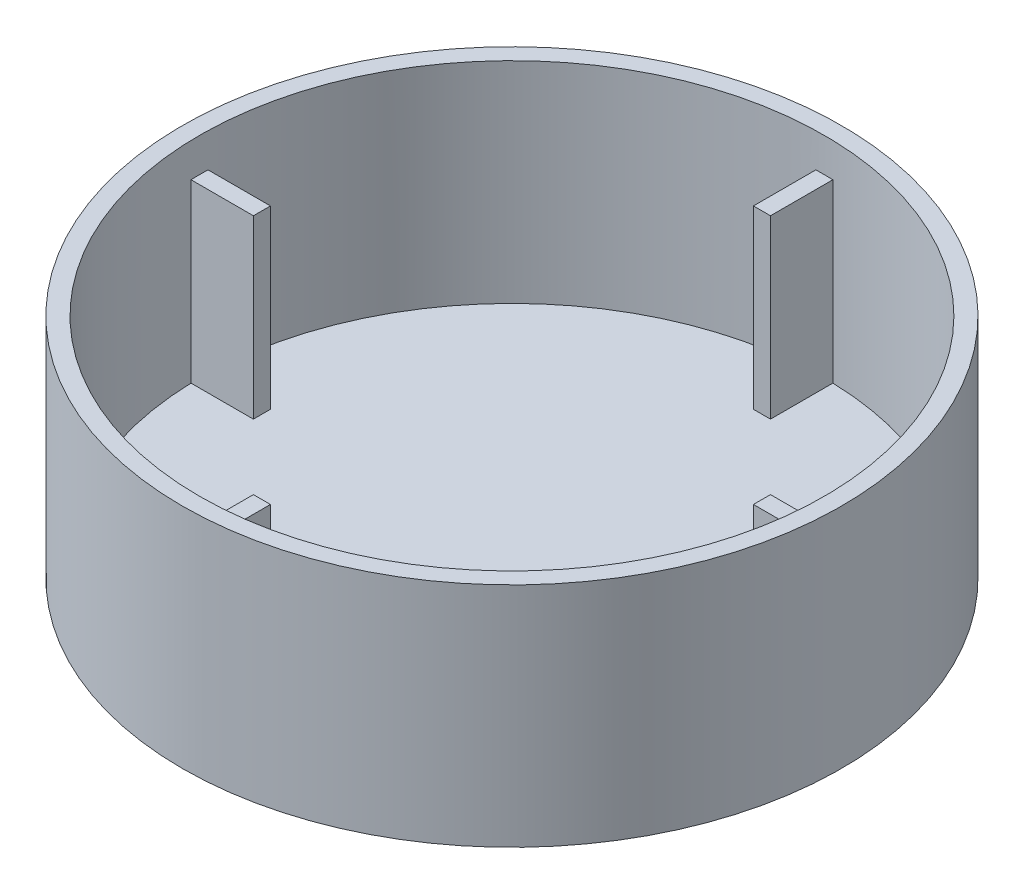
ISO-10303-21;
HEADER;
FILE_DESCRIPTION(('STEP AP214'),'2;1');
FILE_NAME('part.step','',(''),(''),'','','');
FILE_SCHEMA(('AUTOMOTIVE_DESIGN { 1 0 10303 214 1 1 1 1 }'));
ENDSEC;
DATA;
#1=APPLICATION_CONTEXT('core data for automotive mechanical design processes');
#2=APPLICATION_PROTOCOL_DEFINITION('international standard','automotive_design',2000,#1);
#3=PRODUCT_CONTEXT('',#1,'mechanical');
#4=PRODUCT('Part','Part','',(#3));
#5=PRODUCT_RELATED_PRODUCT_CATEGORY('part','',(#4));
#6=PRODUCT_DEFINITION_FORMATION('','',#4);
#7=PRODUCT_DEFINITION_CONTEXT('part definition',#1,'design');
#8=PRODUCT_DEFINITION('design','',#6,#7);
#9=PRODUCT_DEFINITION_SHAPE('','',#8);
#10=(LENGTH_UNIT() NAMED_UNIT(*) SI_UNIT(.MILLI.,.METRE.));
#11=(NAMED_UNIT(*) PLANE_ANGLE_UNIT() SI_UNIT($,.RADIAN.));
#12=(NAMED_UNIT(*) SI_UNIT($,.STERADIAN.) SOLID_ANGLE_UNIT());
#13=UNCERTAINTY_MEASURE_WITH_UNIT(LENGTH_MEASURE(1.E-05),#10,'distance_accuracy_value','');
#14=(GEOMETRIC_REPRESENTATION_CONTEXT(3) GLOBAL_UNCERTAINTY_ASSIGNED_CONTEXT((#13)) GLOBAL_UNIT_ASSIGNED_CONTEXT((#10,
#11,#12)) REPRESENTATION_CONTEXT('',''));
#15=CARTESIAN_POINT('',(0.,0.,0.));
#16=DIRECTION('',(0.,0.,1.));
#17=DIRECTION('',(1.,0.,0.));
#18=AXIS2_PLACEMENT_3D('',#15,#16,#17);
#19=CARTESIAN_POINT('',(0.,20.,0.));
#20=DIRECTION('',(0.,-1.,0.));
#21=DIRECTION('',(0.,0.,-1.));
#22=AXIS2_PLACEMENT_3D('',#19,#20,#21);
#23=CYLINDRICAL_SURFACE('',#22,27.5);
#24=CARTESIAN_POINT('',(0.,20.,0.));
#25=DIRECTION('',(0.,1.,0.));
#26=DIRECTION('',(0.,0.,1.));
#27=AXIS2_PLACEMENT_3D('',#24,#25,#26);
#28=CIRCLE('',#27,27.5);
#29=CARTESIAN_POINT('',(0.,20.,27.5));
#30=VERTEX_POINT('',#29);
#31=EDGE_CURVE('E256',#30,#30,#28,.T.);
#32=ORIENTED_EDGE('',*,*,#31,.T.);
#33=EDGE_LOOP('',(#32));
#34=FACE_BOUND('',#33,.T.);
#35=CARTESIAN_POINT('',(0.,17.,0.));
#36=DIRECTION('',(0.,1.,0.));
#37=DIRECTION('',(0.,0.,1.));
#38=AXIS2_PLACEMENT_3D('',#35,#36,#37);
#39=CIRCLE('',#38,27.5);
#40=CARTESIAN_POINT('',(-27.4897708247995,17.,-0.750000000000288));
#41=VERTEX_POINT('',#40);
#42=CARTESIAN_POINT('',(-27.4897708247995,17.,0.749999999999712));
#43=VERTEX_POINT('',#42);
#44=EDGE_CURVE('E12',#41,#43,#39,.T.);
#45=ORIENTED_EDGE('',*,*,#44,.F.);
#46=DIRECTION('',(0.,-1.,0.));
#47=VECTOR('',#46,1.);
#48=CARTESIAN_POINT('',(-27.4897708247995,20.,-0.750000000000288));
#49=LINE('',#48,#47);
#50=CARTESIAN_POINT('',(-27.4897708247995,1.5,-0.750000000000288));
#51=VERTEX_POINT('',#50);
#52=EDGE_CURVE('E153',#41,#51,#49,.T.);
#53=ORIENTED_EDGE('',*,*,#52,.T.);
#54=CARTESIAN_POINT('',(0.,1.5,0.));
#55=DIRECTION('',(0.,1.,0.));
#56=DIRECTION('',(0.,0.,1.));
#57=AXIS2_PLACEMENT_3D('',#54,#55,#56);
#58=CIRCLE('',#57,27.5);
#59=CARTESIAN_POINT('',(-0.75,1.5,-27.4897708247995));
#60=VERTEX_POINT('',#59);
#61=EDGE_CURVE('E253',#60,#51,#58,.T.);
#62=ORIENTED_EDGE('',*,*,#61,.F.);
#63=DIRECTION('',(0.,-1.,0.));
#64=VECTOR('',#63,1.);
#65=CARTESIAN_POINT('',(-0.75,20.,-27.4897708247995));
#66=LINE('',#65,#64);
#67=CARTESIAN_POINT('',(-0.75,17.,-27.4897708247995));
#68=VERTEX_POINT('',#67);
#69=EDGE_CURVE('E249',#60,#68,#66,.F.);
#70=ORIENTED_EDGE('',*,*,#69,.T.);
#71=CARTESIAN_POINT('',(0.,17.,0.));
#72=DIRECTION('',(0.,1.,0.));
#73=DIRECTION('',(0.,0.,1.));
#74=AXIS2_PLACEMENT_3D('',#71,#72,#73);
#75=CIRCLE('',#74,27.5);
#76=CARTESIAN_POINT('',(0.75,17.,-27.4897708247995));
#77=VERTEX_POINT('',#76);
#78=EDGE_CURVE('E269',#77,#68,#75,.T.);
#79=ORIENTED_EDGE('',*,*,#78,.F.);
#80=DIRECTION('',(0.,-1.,0.));
#81=VECTOR('',#80,1.);
#82=CARTESIAN_POINT('',(0.75,20.,-27.4897708247995));
#83=LINE('',#82,#81);
#84=CARTESIAN_POINT('',(0.75,1.5,-27.4897708247995));
#85=VERTEX_POINT('',#84);
#86=EDGE_CURVE('E238',#77,#85,#83,.T.);
#87=ORIENTED_EDGE('',*,*,#86,.T.);
#88=CARTESIAN_POINT('',(27.4897708247995,1.5,-0.749999999999904));
#89=VERTEX_POINT('',#88);
#90=EDGE_CURVE('E252',#89,#85,#58,.T.);
#91=ORIENTED_EDGE('',*,*,#90,.F.);
#92=DIRECTION('',(0.,-1.,0.));
#93=VECTOR('',#92,1.);
#94=CARTESIAN_POINT('',(27.4897708247995,20.,-0.749999999999904));
#95=LINE('',#94,#93);
#96=CARTESIAN_POINT('',(27.4897708247995,17.,-0.749999999999904));
#97=VERTEX_POINT('',#96);
#98=EDGE_CURVE('E214',#89,#97,#95,.F.);
#99=ORIENTED_EDGE('',*,*,#98,.T.);
#100=CARTESIAN_POINT('',(0.,17.,0.));
#101=DIRECTION('',(0.,1.,0.));
#102=DIRECTION('',(0.,0.,1.));
#103=AXIS2_PLACEMENT_3D('',#100,#101,#102);
#104=CIRCLE('',#103,27.5);
#105=CARTESIAN_POINT('',(27.4897708247995,17.,0.750000000000096));
#106=VERTEX_POINT('',#105);
#107=EDGE_CURVE('E274',#106,#97,#104,.T.);
#108=ORIENTED_EDGE('',*,*,#107,.F.);
#109=DIRECTION('',(0.,-1.,0.));
#110=VECTOR('',#109,1.);
#111=CARTESIAN_POINT('',(27.4897708247995,20.,0.750000000000096));
#112=LINE('',#111,#110);
#113=CARTESIAN_POINT('',(27.4897708247995,1.5,0.750000000000096));
#114=VERTEX_POINT('',#113);
#115=EDGE_CURVE('E224',#106,#114,#112,.T.);
#116=ORIENTED_EDGE('',*,*,#115,.T.);
#117=CARTESIAN_POINT('',(0.749999999999808,1.5,27.4897708247995));
#118=VERTEX_POINT('',#117);
#119=EDGE_CURVE('E285',#118,#114,#58,.T.);
#120=ORIENTED_EDGE('',*,*,#119,.F.);
#121=DIRECTION('',(0.,-1.,0.));
#122=VECTOR('',#121,1.);
#123=CARTESIAN_POINT('',(0.749999999999808,20.,27.4897708247995));
#124=LINE('',#123,#122);
#125=CARTESIAN_POINT('',(0.749999999999808,17.,27.4897708247995));
#126=VERTEX_POINT('',#125);
#127=EDGE_CURVE('E57',#118,#126,#124,.F.);
#128=ORIENTED_EDGE('',*,*,#127,.T.);
#129=CARTESIAN_POINT('',(0.,17.,0.));
#130=DIRECTION('',(0.,1.,0.));
#131=DIRECTION('',(0.,0.,1.));
#132=AXIS2_PLACEMENT_3D('',#129,#130,#131);
#133=CIRCLE('',#132,27.5);
#134=CARTESIAN_POINT('',(-0.750000000000192,17.,27.4897708247995));
#135=VERTEX_POINT('',#134);
#136=EDGE_CURVE('E278',#135,#126,#133,.T.);
#137=ORIENTED_EDGE('',*,*,#136,.F.);
#138=DIRECTION('',(0.,-1.,0.));
#139=VECTOR('',#138,1.);
#140=CARTESIAN_POINT('',(-0.750000000000192,20.,27.4897708247995));
#141=LINE('',#140,#139);
#142=CARTESIAN_POINT('',(-0.750000000000192,1.5,27.4897708247995));
#143=VERTEX_POINT('',#142);
#144=EDGE_CURVE('E199',#135,#143,#141,.T.);
#145=ORIENTED_EDGE('',*,*,#144,.T.);
#146=CARTESIAN_POINT('',(-27.4897708247995,1.5,0.749999999999712));
#147=VERTEX_POINT('',#146);
#148=EDGE_CURVE('E257',#147,#143,#58,.T.);
#149=ORIENTED_EDGE('',*,*,#148,.F.);
#150=DIRECTION('',(0.,-1.,0.));
#151=VECTOR('',#150,1.);
#152=CARTESIAN_POINT('',(-27.4897708247995,20.,0.749999999999712));
#153=LINE('',#152,#151);
#154=EDGE_CURVE('E49',#147,#43,#153,.F.);
#155=ORIENTED_EDGE('',*,*,#154,.T.);
#156=EDGE_LOOP('',(#45,#53,#62,#70,#79,#87,#91,#99,#108,#116,#120,#128,#137,#145,#149,#155));
#157=FACE_BOUND('',#156,.T.);
#158=ADVANCED_FACE('F34',(#34,#157),#23,.F.);
#159=CARTESIAN_POINT('',(0.,1.5,0.));
#160=DIRECTION('',(0.,1.,0.));
#161=DIRECTION('',(0.,0.,1.));
#162=AXIS2_PLACEMENT_3D('',#159,#160,#161);
#163=PLANE('',#162);
#164=ORIENTED_EDGE('',*,*,#61,.T.);
#165=DIRECTION('',(-1.,0.,0.));
#166=VECTOR('',#165,1.);
#167=CARTESIAN_POINT('',(-22.,1.5,-0.75000000000023));
#168=LINE('',#167,#166);
#169=CARTESIAN_POINT('',(-22.,1.5,-0.75000000000023));
#170=VERTEX_POINT('',#169);
#171=EDGE_CURVE('E166',#170,#51,#168,.T.);
#172=ORIENTED_EDGE('',*,*,#171,.F.);
#173=DIRECTION('',(0.,0.,-1.));
#174=VECTOR('',#173,1.);
#175=CARTESIAN_POINT('',(-22.,1.5,0.74999999999977));
#176=LINE('',#175,#174);
#177=CARTESIAN_POINT('',(-22.,1.5,0.74999999999977));
#178=VERTEX_POINT('',#177);
#179=EDGE_CURVE('E164',#178,#170,#176,.T.);
#180=ORIENTED_EDGE('',*,*,#179,.F.);
#181=DIRECTION('',(-1.,0.,0.));
#182=VECTOR('',#181,1.);
#183=CARTESIAN_POINT('',(0.,1.5,0.75));
#184=LINE('',#183,#182);
#185=EDGE_CURVE('E42',#178,#147,#184,.T.);
#186=ORIENTED_EDGE('',*,*,#185,.T.);
#187=ORIENTED_EDGE('',*,*,#148,.T.);
#188=DIRECTION('',(0.,0.,1.));
#189=VECTOR('',#188,1.);
#190=CARTESIAN_POINT('',(-0.750000000000154,1.5,22.));
#191=LINE('',#190,#189);
#192=CARTESIAN_POINT('',(-0.750000000000154,1.5,22.));
#193=VERTEX_POINT('',#192);
#194=EDGE_CURVE('E180',#193,#143,#191,.T.);
#195=ORIENTED_EDGE('',*,*,#194,.F.);
#196=DIRECTION('',(-1.,0.,0.));
#197=VECTOR('',#196,1.);
#198=CARTESIAN_POINT('',(0.749999999999846,1.5,22.));
#199=LINE('',#198,#197);
#200=CARTESIAN_POINT('',(0.749999999999846,1.5,22.));
#201=VERTEX_POINT('',#200);
#202=EDGE_CURVE('E185',#201,#193,#199,.T.);
#203=ORIENTED_EDGE('',*,*,#202,.F.);
#204=DIRECTION('',(0.,0.,1.));
#205=VECTOR('',#204,1.);
#206=CARTESIAN_POINT('',(0.75,1.5,0.));
#207=LINE('',#206,#205);
#208=EDGE_CURVE('E276',#201,#118,#207,.T.);
#209=ORIENTED_EDGE('',*,*,#208,.T.);
#210=ORIENTED_EDGE('',*,*,#119,.T.);
#211=DIRECTION('',(1.,0.,0.));
#212=VECTOR('',#211,1.);
#213=CARTESIAN_POINT('',(22.,1.5,0.750000000000077));
#214=LINE('',#213,#212);
#215=CARTESIAN_POINT('',(22.,1.5,0.750000000000077));
#216=VERTEX_POINT('',#215);
#217=EDGE_CURVE('E203',#216,#114,#214,.T.);
#218=ORIENTED_EDGE('',*,*,#217,.F.);
#219=DIRECTION('',(0.,0.,1.));
#220=VECTOR('',#219,1.);
#221=CARTESIAN_POINT('',(22.,1.5,-0.749999999999923));
#222=LINE('',#221,#220);
#223=CARTESIAN_POINT('',(22.,1.5,-0.749999999999923));
#224=VERTEX_POINT('',#223);
#225=EDGE_CURVE('E208',#224,#216,#222,.T.);
#226=ORIENTED_EDGE('',*,*,#225,.F.);
#227=DIRECTION('',(1.,0.,0.));
#228=VECTOR('',#227,1.);
#229=CARTESIAN_POINT('',(0.,1.5,-0.75));
#230=LINE('',#229,#228);
#231=EDGE_CURVE('E271',#224,#89,#230,.T.);
#232=ORIENTED_EDGE('',*,*,#231,.T.);
#233=ORIENTED_EDGE('',*,*,#90,.T.);
#234=DIRECTION('',(0.,0.,-1.));
#235=VECTOR('',#234,1.);
#236=CARTESIAN_POINT('',(0.75,1.5,-22.));
#237=LINE('',#236,#235);
#238=CARTESIAN_POINT('',(0.75,1.5,-22.));
#239=VERTEX_POINT('',#238);
#240=EDGE_CURVE('E228',#239,#85,#237,.T.);
#241=ORIENTED_EDGE('',*,*,#240,.F.);
#242=DIRECTION('',(1.,0.,0.));
#243=VECTOR('',#242,1.);
#244=CARTESIAN_POINT('',(-0.75,1.5,-22.));
#245=LINE('',#244,#243);
#246=CARTESIAN_POINT('',(-0.75,1.5,-22.));
#247=VERTEX_POINT('',#246);
#248=EDGE_CURVE('E233',#247,#239,#245,.T.);
#249=ORIENTED_EDGE('',*,*,#248,.F.);
#250=DIRECTION('',(0.,0.,-1.));
#251=VECTOR('',#250,1.);
#252=CARTESIAN_POINT('',(-0.75,1.5,0.));
#253=LINE('',#252,#251);
#254=EDGE_CURVE('E264',#247,#60,#253,.T.);
#255=ORIENTED_EDGE('',*,*,#254,.T.);
#256=EDGE_LOOP('',(#164,#172,#180,#186,#187,#195,#203,#209,#210,#218,#226,#232,#233,#241,#249,#255));
#257=FACE_BOUND('',#256,.T.);
#258=ADVANCED_FACE('F281',(#257),#163,.T.);
#259=CARTESIAN_POINT('',(0.,20.,0.));
#260=DIRECTION('',(0.,-1.,0.));
#261=DIRECTION('',(0.,0.,-1.));
#262=AXIS2_PLACEMENT_3D('',#259,#260,#261);
#263=CYLINDRICAL_SURFACE('',#262,29.);
#264=CARTESIAN_POINT('',(0.,20.,0.));
#265=DIRECTION('',(0.,1.,0.));
#266=DIRECTION('',(0.,0.,1.));
#267=AXIS2_PLACEMENT_3D('',#264,#265,#266);
#268=CIRCLE('',#267,29.);
#269=CARTESIAN_POINT('',(0.,20.,29.));
#270=VERTEX_POINT('',#269);
#271=EDGE_CURVE('E261',#270,#270,#268,.T.);
#272=ORIENTED_EDGE('',*,*,#271,.F.);
#273=EDGE_LOOP('',(#272));
#274=FACE_BOUND('',#273,.T.);
#275=CARTESIAN_POINT('',(0.,0.,0.));
#276=DIRECTION('',(0.,1.,0.));
#277=DIRECTION('',(0.,0.,1.));
#278=AXIS2_PLACEMENT_3D('',#275,#276,#277);
#279=CIRCLE('',#278,29.);
#280=CARTESIAN_POINT('',(0.,0.,29.));
#281=VERTEX_POINT('',#280);
#282=EDGE_CURVE('E260',#281,#281,#279,.T.);
#283=ORIENTED_EDGE('',*,*,#282,.T.);
#284=EDGE_LOOP('',(#283));
#285=FACE_BOUND('',#284,.T.);
#286=ADVANCED_FACE('F36',(#274,#285),#263,.T.);
#287=CARTESIAN_POINT('',(0.,20.,0.));
#288=DIRECTION('',(0.,1.,0.));
#289=DIRECTION('',(0.,0.,1.));
#290=AXIS2_PLACEMENT_3D('',#287,#288,#289);
#291=PLANE('',#290);
#292=ORIENTED_EDGE('',*,*,#31,.F.);
#293=EDGE_LOOP('',(#292));
#294=FACE_BOUND('',#293,.T.);
#295=ORIENTED_EDGE('',*,*,#271,.T.);
#296=EDGE_LOOP('',(#295));
#297=FACE_BOUND('',#296,.T.);
#298=ADVANCED_FACE('F323',(#294,#297),#291,.T.);
#299=CARTESIAN_POINT('',(0.,0.,0.));
#300=DIRECTION('',(0.,1.,0.));
#301=DIRECTION('',(0.,0.,1.));
#302=AXIS2_PLACEMENT_3D('',#299,#300,#301);
#303=PLANE('',#302);
#304=ORIENTED_EDGE('',*,*,#282,.F.);
#305=EDGE_LOOP('',(#304));
#306=FACE_BOUND('',#305,.T.);
#307=ADVANCED_FACE('F325',(#306),#303,.F.);
#308=CARTESIAN_POINT('',(0.,17.,0.));
#309=DIRECTION('',(0.,1.,0.));
#310=DIRECTION('',(0.,0.,1.));
#311=AXIS2_PLACEMENT_3D('',#308,#309,#310);
#312=PLANE('',#311);
#313=DIRECTION('',(0.,0.,-1.));
#314=VECTOR('',#313,1.);
#315=CARTESIAN_POINT('',(0.75,17.,-22.));
#316=LINE('',#315,#314);
#317=CARTESIAN_POINT('',(0.75,17.,-22.));
#318=VERTEX_POINT('',#317);
#319=EDGE_CURVE('E235',#318,#77,#316,.T.);
#320=ORIENTED_EDGE('',*,*,#319,.T.);
#321=ORIENTED_EDGE('',*,*,#78,.T.);
#322=DIRECTION('',(0.,0.,1.));
#323=VECTOR('',#322,1.);
#324=CARTESIAN_POINT('',(-0.75,17.,-22.));
#325=LINE('',#324,#323);
#326=CARTESIAN_POINT('',(-0.75,17.,-22.));
#327=VERTEX_POINT('',#326);
#328=EDGE_CURVE('E231',#68,#327,#325,.T.);
#329=ORIENTED_EDGE('',*,*,#328,.T.);
#330=DIRECTION('',(1.,0.,0.));
#331=VECTOR('',#330,1.);
#332=CARTESIAN_POINT('',(-0.75,17.,-22.));
#333=LINE('',#332,#331);
#334=EDGE_CURVE('E239',#327,#318,#333,.T.);
#335=ORIENTED_EDGE('',*,*,#334,.T.);
#336=EDGE_LOOP('',(#320,#321,#329,#335));
#337=FACE_BOUND('',#336,.T.);
#338=ADVANCED_FACE('F299',(#337),#312,.T.);
#339=CARTESIAN_POINT('',(-0.75,26.2698768186236,-22.));
#340=DIRECTION('',(1.,0.,0.));
#341=DIRECTION('',(0.,0.,-1.));
#342=AXIS2_PLACEMENT_3D('',#339,#340,#341);
#343=PLANE('',#342);
#344=ORIENTED_EDGE('',*,*,#69,.F.);
#345=ORIENTED_EDGE('',*,*,#254,.F.);
#346=DIRECTION('',(0.,-1.,0.));
#347=VECTOR('',#346,1.);
#348=CARTESIAN_POINT('',(-0.75,26.2698768186236,-22.));
#349=LINE('',#348,#347);
#350=EDGE_CURVE('E227',#327,#247,#349,.T.);
#351=ORIENTED_EDGE('',*,*,#350,.F.);
#352=ORIENTED_EDGE('',*,*,#328,.F.);
#353=EDGE_LOOP('',(#344,#345,#351,#352));
#354=FACE_BOUND('',#353,.T.);
#355=ADVANCED_FACE('F303',(#354),#343,.F.);
#356=CARTESIAN_POINT('',(-0.75,26.2698768186236,-22.));
#357=DIRECTION('',(0.,0.,-1.));
#358=DIRECTION('',(-1.,0.,0.));
#359=AXIS2_PLACEMENT_3D('',#356,#357,#358);
#360=PLANE('',#359);
#361=ORIENTED_EDGE('',*,*,#334,.F.);
#362=ORIENTED_EDGE('',*,*,#350,.T.);
#363=ORIENTED_EDGE('',*,*,#248,.T.);
#364=DIRECTION('',(0.,-1.,0.));
#365=VECTOR('',#364,1.);
#366=CARTESIAN_POINT('',(0.75,26.2698768186236,-22.));
#367=LINE('',#366,#365);
#368=EDGE_CURVE('E232',#318,#239,#367,.T.);
#369=ORIENTED_EDGE('',*,*,#368,.F.);
#370=EDGE_LOOP('',(#361,#362,#363,#369));
#371=FACE_BOUND('',#370,.T.);
#372=ADVANCED_FACE('F305',(#371),#360,.F.);
#373=CARTESIAN_POINT('',(0.75,26.2698768186236,-22.));
#374=DIRECTION('',(-1.,0.,0.));
#375=DIRECTION('',(0.,0.,1.));
#376=AXIS2_PLACEMENT_3D('',#373,#374,#375);
#377=PLANE('',#376);
#378=ORIENTED_EDGE('',*,*,#86,.F.);
#379=ORIENTED_EDGE('',*,*,#319,.F.);
#380=ORIENTED_EDGE('',*,*,#368,.T.);
#381=ORIENTED_EDGE('',*,*,#240,.T.);
#382=EDGE_LOOP('',(#378,#379,#380,#381));
#383=FACE_BOUND('',#382,.T.);
#384=ADVANCED_FACE('F293',(#383),#377,.F.);
#385=CARTESIAN_POINT('',(0.,17.,0.));
#386=DIRECTION('',(0.,1.,0.));
#387=DIRECTION('',(0.,0.,1.));
#388=AXIS2_PLACEMENT_3D('',#385,#386,#387);
#389=PLANE('',#388);
#390=DIRECTION('',(1.,0.,0.));
#391=VECTOR('',#390,1.);
#392=CARTESIAN_POINT('',(22.,17.,0.750000000000077));
#393=LINE('',#392,#391);
#394=CARTESIAN_POINT('',(22.,17.,0.750000000000077));
#395=VERTEX_POINT('',#394);
#396=EDGE_CURVE('E211',#395,#106,#393,.T.);
#397=ORIENTED_EDGE('',*,*,#396,.T.);
#398=ORIENTED_EDGE('',*,*,#107,.T.);
#399=DIRECTION('',(-1.,0.,0.));
#400=VECTOR('',#399,1.);
#401=CARTESIAN_POINT('',(22.,17.,-0.749999999999923));
#402=LINE('',#401,#400);
#403=CARTESIAN_POINT('',(22.,17.,-0.749999999999923));
#404=VERTEX_POINT('',#403);
#405=EDGE_CURVE('E206',#97,#404,#402,.T.);
#406=ORIENTED_EDGE('',*,*,#405,.T.);
#407=DIRECTION('',(0.,0.,1.));
#408=VECTOR('',#407,1.);
#409=CARTESIAN_POINT('',(22.,17.,-0.749999999999923));
#410=LINE('',#409,#408);
#411=EDGE_CURVE('E215',#404,#395,#410,.T.);
#412=ORIENTED_EDGE('',*,*,#411,.T.);
#413=EDGE_LOOP('',(#397,#398,#406,#412));
#414=FACE_BOUND('',#413,.T.);
#415=ADVANCED_FACE('F386',(#414),#389,.T.);
#416=CARTESIAN_POINT('',(22.,26.2698768186236,-0.749999999999923));
#417=DIRECTION('',(1.,0.,0.));
#418=DIRECTION('',(0.,0.,-1.));
#419=AXIS2_PLACEMENT_3D('',#416,#417,#418);
#420=PLANE('',#419);
#421=ORIENTED_EDGE('',*,*,#411,.F.);
#422=DIRECTION('',(0.,-1.,0.));
#423=VECTOR('',#422,1.);
#424=CARTESIAN_POINT('',(22.,26.2698768186236,-0.749999999999923));
#425=LINE('',#424,#423);
#426=EDGE_CURVE('E202',#404,#224,#425,.T.);
#427=ORIENTED_EDGE('',*,*,#426,.T.);
#428=ORIENTED_EDGE('',*,*,#225,.T.);
#429=DIRECTION('',(0.,-1.,0.));
#430=VECTOR('',#429,1.);
#431=CARTESIAN_POINT('',(22.,26.2698768186236,0.750000000000077));
#432=LINE('',#431,#430);
#433=EDGE_CURVE('E207',#395,#216,#432,.T.);
#434=ORIENTED_EDGE('',*,*,#433,.F.);
#435=EDGE_LOOP('',(#421,#427,#428,#434));
#436=FACE_BOUND('',#435,.T.);
#437=ADVANCED_FACE('F395',(#436),#420,.F.);
#438=CARTESIAN_POINT('',(22.,26.2698768186236,0.750000000000077));
#439=DIRECTION('',(0.,0.,-1.));
#440=DIRECTION('',(-1.,0.,0.));
#441=AXIS2_PLACEMENT_3D('',#438,#439,#440);
#442=PLANE('',#441);
#443=ORIENTED_EDGE('',*,*,#115,.F.);
#444=ORIENTED_EDGE('',*,*,#396,.F.);
#445=ORIENTED_EDGE('',*,*,#433,.T.);
#446=ORIENTED_EDGE('',*,*,#217,.T.);
#447=EDGE_LOOP('',(#443,#444,#445,#446));
#448=FACE_BOUND('',#447,.T.);
#449=ADVANCED_FACE('F405',(#448),#442,.F.);
#450=CARTESIAN_POINT('',(22.,26.2698768186236,-0.749999999999923));
#451=DIRECTION('',(0.,0.,1.));
#452=DIRECTION('',(1.,0.,0.));
#453=AXIS2_PLACEMENT_3D('',#450,#451,#452);
#454=PLANE('',#453);
#455=ORIENTED_EDGE('',*,*,#98,.F.);
#456=ORIENTED_EDGE('',*,*,#231,.F.);
#457=ORIENTED_EDGE('',*,*,#426,.F.);
#458=ORIENTED_EDGE('',*,*,#405,.F.);
#459=EDGE_LOOP('',(#455,#456,#457,#458));
#460=FACE_BOUND('',#459,.T.);
#461=ADVANCED_FACE('F415',(#460),#454,.F.);
#462=CARTESIAN_POINT('',(0.,17.,0.));
#463=DIRECTION('',(0.,1.,0.));
#464=DIRECTION('',(0.,0.,1.));
#465=AXIS2_PLACEMENT_3D('',#462,#463,#464);
#466=PLANE('',#465);
#467=DIRECTION('',(0.,0.,1.));
#468=VECTOR('',#467,1.);
#469=CARTESIAN_POINT('',(-0.750000000000154,17.,22.));
#470=LINE('',#469,#468);
#471=CARTESIAN_POINT('',(-0.750000000000154,17.,22.));
#472=VERTEX_POINT('',#471);
#473=EDGE_CURVE('E188',#472,#135,#470,.T.);
#474=ORIENTED_EDGE('',*,*,#473,.T.);
#475=ORIENTED_EDGE('',*,*,#136,.T.);
#476=DIRECTION('',(0.,0.,-1.));
#477=VECTOR('',#476,1.);
#478=CARTESIAN_POINT('',(0.749999999999846,17.,22.));
#479=LINE('',#478,#477);
#480=CARTESIAN_POINT('',(0.749999999999846,17.,22.));
#481=VERTEX_POINT('',#480);
#482=EDGE_CURVE('E183',#126,#481,#479,.T.);
#483=ORIENTED_EDGE('',*,*,#482,.T.);
#484=DIRECTION('',(-1.,0.,0.));
#485=VECTOR('',#484,1.);
#486=CARTESIAN_POINT('',(0.749999999999846,17.,22.));
#487=LINE('',#486,#485);
#488=EDGE_CURVE('E191',#481,#472,#487,.T.);
#489=ORIENTED_EDGE('',*,*,#488,.T.);
#490=EDGE_LOOP('',(#474,#475,#483,#489));
#491=FACE_BOUND('',#490,.T.);
#492=ADVANCED_FACE('F425',(#491),#466,.T.);
#493=CARTESIAN_POINT('',(0.749999999999846,26.2698768186236,22.));
#494=DIRECTION('',(0.,0.,1.));
#495=DIRECTION('',(1.,0.,0.));
#496=AXIS2_PLACEMENT_3D('',#493,#494,#495);
#497=PLANE('',#496);
#498=ORIENTED_EDGE('',*,*,#488,.F.);
#499=DIRECTION('',(0.,-1.,0.));
#500=VECTOR('',#499,1.);
#501=CARTESIAN_POINT('',(0.749999999999846,26.2698768186236,22.));
#502=LINE('',#501,#500);
#503=EDGE_CURVE('E179',#481,#201,#502,.T.);
#504=ORIENTED_EDGE('',*,*,#503,.T.);
#505=ORIENTED_EDGE('',*,*,#202,.T.);
#506=DIRECTION('',(0.,-1.,0.));
#507=VECTOR('',#506,1.);
#508=CARTESIAN_POINT('',(-0.750000000000154,26.2698768186236,22.));
#509=LINE('',#508,#507);
#510=EDGE_CURVE('E184',#472,#193,#509,.T.);
#511=ORIENTED_EDGE('',*,*,#510,.F.);
#512=EDGE_LOOP('',(#498,#504,#505,#511));
#513=FACE_BOUND('',#512,.T.);
#514=ADVANCED_FACE('F435',(#513),#497,.F.);
#515=CARTESIAN_POINT('',(-0.750000000000154,26.2698768186236,22.));
#516=DIRECTION('',(1.,0.,0.));
#517=DIRECTION('',(0.,0.,-1.));
#518=AXIS2_PLACEMENT_3D('',#515,#516,#517);
#519=PLANE('',#518);
#520=ORIENTED_EDGE('',*,*,#144,.F.);
#521=ORIENTED_EDGE('',*,*,#473,.F.);
#522=ORIENTED_EDGE('',*,*,#510,.T.);
#523=ORIENTED_EDGE('',*,*,#194,.T.);
#524=EDGE_LOOP('',(#520,#521,#522,#523));
#525=FACE_BOUND('',#524,.T.);
#526=ADVANCED_FACE('F445',(#525),#519,.F.);
#527=CARTESIAN_POINT('',(0.749999999999846,26.2698768186236,22.));
#528=DIRECTION('',(-1.,0.,0.));
#529=DIRECTION('',(0.,0.,1.));
#530=AXIS2_PLACEMENT_3D('',#527,#528,#529);
#531=PLANE('',#530);
#532=ORIENTED_EDGE('',*,*,#127,.F.);
#533=ORIENTED_EDGE('',*,*,#208,.F.);
#534=ORIENTED_EDGE('',*,*,#503,.F.);
#535=ORIENTED_EDGE('',*,*,#482,.F.);
#536=EDGE_LOOP('',(#532,#533,#534,#535));
#537=FACE_BOUND('',#536,.T.);
#538=ADVANCED_FACE('F455',(#537),#531,.F.);
#539=CARTESIAN_POINT('',(0.,17.,0.));
#540=DIRECTION('',(0.,1.,0.));
#541=DIRECTION('',(0.,0.,1.));
#542=AXIS2_PLACEMENT_3D('',#539,#540,#541);
#543=PLANE('',#542);
#544=DIRECTION('',(-1.,0.,0.));
#545=VECTOR('',#544,1.);
#546=CARTESIAN_POINT('',(-22.,17.,-0.75000000000023));
#547=LINE('',#546,#545);
#548=CARTESIAN_POINT('',(-22.,17.,-0.75000000000023));
#549=VERTEX_POINT('',#548);
#550=EDGE_CURVE('E147',#549,#41,#547,.T.);
#551=ORIENTED_EDGE('',*,*,#550,.T.);
#552=ORIENTED_EDGE('',*,*,#44,.T.);
#553=DIRECTION('',(1.,0.,0.));
#554=VECTOR('',#553,1.);
#555=CARTESIAN_POINT('',(-22.,17.,0.74999999999977));
#556=LINE('',#555,#554);
#557=CARTESIAN_POINT('',(-22.,17.,0.74999999999977));
#558=VERTEX_POINT('',#557);
#559=EDGE_CURVE('E169',#43,#558,#556,.T.);
#560=ORIENTED_EDGE('',*,*,#559,.T.);
#561=DIRECTION('',(0.,0.,-1.));
#562=VECTOR('',#561,1.);
#563=CARTESIAN_POINT('',(-22.,17.,0.74999999999977));
#564=LINE('',#563,#562);
#565=EDGE_CURVE('E157',#558,#549,#564,.T.);
#566=ORIENTED_EDGE('',*,*,#565,.T.);
#567=EDGE_LOOP('',(#551,#552,#560,#566));
#568=FACE_BOUND('',#567,.T.);
#569=ADVANCED_FACE('F168',(#568),#543,.T.);
#570=CARTESIAN_POINT('',(-22.,26.2698768186236,0.74999999999977));
#571=DIRECTION('',(-1.,0.,0.));
#572=DIRECTION('',(0.,0.,1.));
#573=AXIS2_PLACEMENT_3D('',#570,#571,#572);
#574=PLANE('',#573);
#575=ORIENTED_EDGE('',*,*,#565,.F.);
#576=DIRECTION('',(0.,-1.,0.));
#577=VECTOR('',#576,1.);
#578=CARTESIAN_POINT('',(-22.,26.2698768186236,0.74999999999977));
#579=LINE('',#578,#577);
#580=EDGE_CURVE('E175',#558,#178,#579,.T.);
#581=ORIENTED_EDGE('',*,*,#580,.T.);
#582=ORIENTED_EDGE('',*,*,#179,.T.);
#583=DIRECTION('',(0.,-1.,0.));
#584=VECTOR('',#583,1.);
#585=CARTESIAN_POINT('',(-22.,26.2698768186236,-0.75000000000023));
#586=LINE('',#585,#584);
#587=EDGE_CURVE('E150',#549,#170,#586,.T.);
#588=ORIENTED_EDGE('',*,*,#587,.F.);
#589=EDGE_LOOP('',(#575,#581,#582,#588));
#590=FACE_BOUND('',#589,.T.);
#591=ADVANCED_FACE('F161',(#590),#574,.F.);
#592=CARTESIAN_POINT('',(-22.,26.2698768186236,-0.75000000000023));
#593=DIRECTION('',(0.,0.,1.));
#594=DIRECTION('',(1.,0.,0.));
#595=AXIS2_PLACEMENT_3D('',#592,#593,#594);
#596=PLANE('',#595);
#597=ORIENTED_EDGE('',*,*,#52,.F.);
#598=ORIENTED_EDGE('',*,*,#550,.F.);
#599=ORIENTED_EDGE('',*,*,#587,.T.);
#600=ORIENTED_EDGE('',*,*,#171,.T.);
#601=EDGE_LOOP('',(#597,#598,#599,#600));
#602=FACE_BOUND('',#601,.T.);
#603=ADVANCED_FACE('F149',(#602),#596,.F.);
#604=CARTESIAN_POINT('',(-22.,26.2698768186236,0.74999999999977));
#605=DIRECTION('',(0.,0.,-1.));
#606=DIRECTION('',(-1.,0.,0.));
#607=AXIS2_PLACEMENT_3D('',#604,#605,#606);
#608=PLANE('',#607);
#609=ORIENTED_EDGE('',*,*,#154,.F.);
#610=ORIENTED_EDGE('',*,*,#185,.F.);
#611=ORIENTED_EDGE('',*,*,#580,.F.);
#612=ORIENTED_EDGE('',*,*,#559,.F.);
#613=EDGE_LOOP('',(#609,#610,#611,#612));
#614=FACE_BOUND('',#613,.T.);
#615=ADVANCED_FACE('F306',(#614),#608,.F.);
#616=CLOSED_SHELL('',(#158,#258,#286,#298,#307,#338,#355,#372,#384,#415,#437,#449,#461,#492,
#514,#526,#538,#569,#591,#603,#615));
#617=MANIFOLD_SOLID_BREP('B2',#616);
#618=ADVANCED_BREP_SHAPE_REPRESENTATION('',(#18,#617),#14);
#619=SHAPE_DEFINITION_REPRESENTATION(#9,#618);
ENDSEC;
END-ISO-10303-21;
